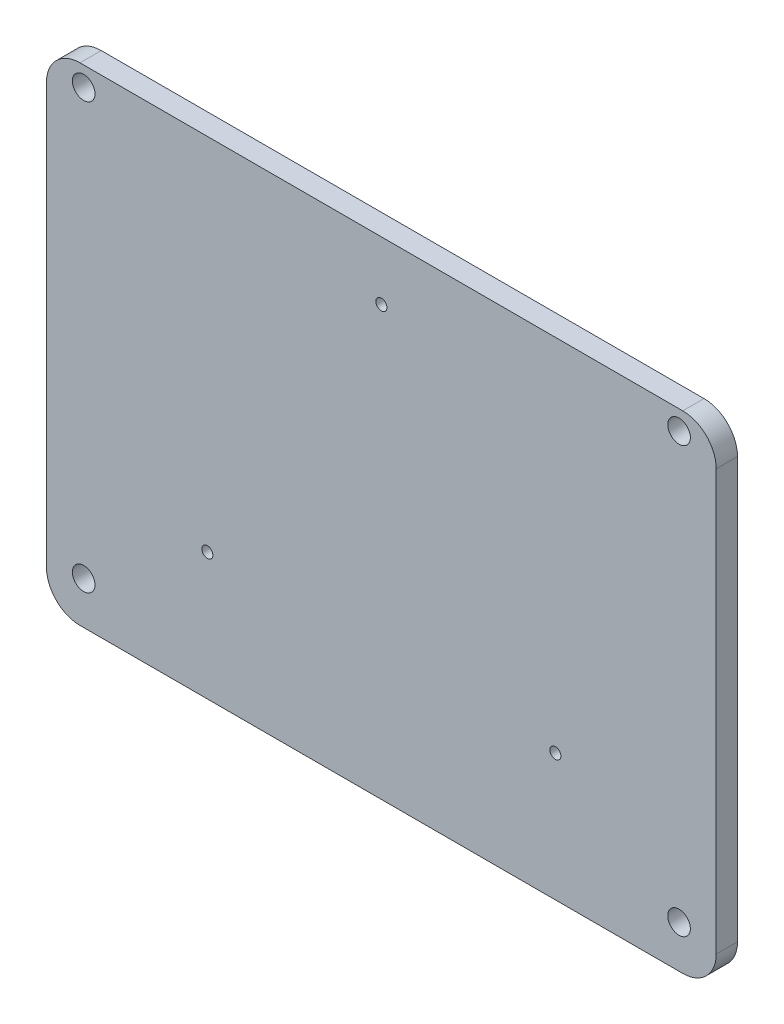
ISO-10303-21;
HEADER;
FILE_DESCRIPTION(('STEP AP214'),'2;1');
FILE_NAME('part.step','',(''),(''),'','','');
FILE_SCHEMA(('AUTOMOTIVE_DESIGN { 1 0 10303 214 1 1 1 1 }'));
ENDSEC;
DATA;
#1=APPLICATION_CONTEXT('core data for automotive mechanical design processes');
#2=APPLICATION_PROTOCOL_DEFINITION('international standard','automotive_design',2000,#1);
#3=PRODUCT_CONTEXT('',#1,'mechanical');
#4=PRODUCT('Part','Part','',(#3));
#5=PRODUCT_RELATED_PRODUCT_CATEGORY('part','',(#4));
#6=PRODUCT_DEFINITION_FORMATION('','',#4);
#7=PRODUCT_DEFINITION_CONTEXT('part definition',#1,'design');
#8=PRODUCT_DEFINITION('design','',#6,#7);
#9=PRODUCT_DEFINITION_SHAPE('','',#8);
#10=(LENGTH_UNIT() NAMED_UNIT(*) SI_UNIT(.MILLI.,.METRE.));
#11=(NAMED_UNIT(*) PLANE_ANGLE_UNIT() SI_UNIT($,.RADIAN.));
#12=(NAMED_UNIT(*) SI_UNIT($,.STERADIAN.) SOLID_ANGLE_UNIT());
#13=UNCERTAINTY_MEASURE_WITH_UNIT(LENGTH_MEASURE(1.E-05),#10,'distance_accuracy_value','');
#14=(GEOMETRIC_REPRESENTATION_CONTEXT(3) GLOBAL_UNCERTAINTY_ASSIGNED_CONTEXT((#13)) GLOBAL_UNIT_ASSIGNED_CONTEXT((#10,
#11,#12)) REPRESENTATION_CONTEXT('',''));
#15=CARTESIAN_POINT('',(0.,0.,0.));
#16=DIRECTION('',(0.,0.,1.));
#17=DIRECTION('',(1.,0.,0.));
#18=AXIS2_PLACEMENT_3D('',#15,#16,#17);
#19=CARTESIAN_POINT('',(0.,0.,6.35));
#20=DIRECTION('',(0.,0.,1.));
#21=DIRECTION('',(1.,0.,0.));
#22=AXIS2_PLACEMENT_3D('',#19,#20,#21);
#23=PLANE('',#22);
#24=DIRECTION('',(-1.,0.,0.));
#25=VECTOR('',#24,1.);
#26=CARTESIAN_POINT('',(0.,-68.,6.35));
#27=LINE('',#26,#25);
#28=CARTESIAN_POINT('',(90.,-68.,6.35));
#29=VERTEX_POINT('',#28);
#30=CARTESIAN_POINT('',(-90.,-68.,6.35));
#31=VERTEX_POINT('',#30);
#32=EDGE_CURVE('E127',#29,#31,#27,.T.);
#33=ORIENTED_EDGE('',*,*,#32,.F.);
#34=CARTESIAN_POINT('',(90.,-58.,6.35));
#35=DIRECTION('',(0.,0.,1.));
#36=DIRECTION('',(1.,0.,0.));
#37=AXIS2_PLACEMENT_3D('',#34,#35,#36);
#38=CIRCLE('',#37,10.);
#39=CARTESIAN_POINT('',(100.,-58.,6.35));
#40=VERTEX_POINT('',#39);
#41=EDGE_CURVE('E110',#29,#40,#38,.T.);
#42=ORIENTED_EDGE('',*,*,#41,.T.);
#43=DIRECTION('',(0.,1.,0.));
#44=VECTOR('',#43,1.);
#45=CARTESIAN_POINT('',(100.,77.5,6.35));
#46=LINE('',#45,#44);
#47=CARTESIAN_POINT('',(100.,67.5,6.35));
#48=VERTEX_POINT('',#47);
#49=EDGE_CURVE('E182',#40,#48,#46,.T.);
#50=ORIENTED_EDGE('',*,*,#49,.T.);
#51=CARTESIAN_POINT('',(90.,67.5,6.35));
#52=DIRECTION('',(0.,0.,1.));
#53=DIRECTION('',(1.,0.,0.));
#54=AXIS2_PLACEMENT_3D('',#51,#52,#53);
#55=CIRCLE('',#54,10.);
#56=CARTESIAN_POINT('',(90.,77.5,6.35));
#57=VERTEX_POINT('',#56);
#58=EDGE_CURVE('E121',#48,#57,#55,.T.);
#59=ORIENTED_EDGE('',*,*,#58,.T.);
#60=DIRECTION('',(-1.,0.,0.));
#61=VECTOR('',#60,1.);
#62=CARTESIAN_POINT('',(-100.,77.5,6.35));
#63=LINE('',#62,#61);
#64=CARTESIAN_POINT('',(-90.,77.5,6.35));
#65=VERTEX_POINT('',#64);
#66=EDGE_CURVE('E184',#57,#65,#63,.T.);
#67=ORIENTED_EDGE('',*,*,#66,.T.);
#68=CARTESIAN_POINT('',(-90.,67.5,6.35));
#69=DIRECTION('',(0.,0.,1.));
#70=DIRECTION('',(1.,0.,0.));
#71=AXIS2_PLACEMENT_3D('',#68,#69,#70);
#72=CIRCLE('',#71,10.);
#73=CARTESIAN_POINT('',(-100.,67.5,6.35));
#74=VERTEX_POINT('',#73);
#75=EDGE_CURVE('E198',#65,#74,#72,.T.);
#76=ORIENTED_EDGE('',*,*,#75,.T.);
#77=DIRECTION('',(0.,-1.,0.));
#78=VECTOR('',#77,1.);
#79=CARTESIAN_POINT('',(-100.,77.5,6.35));
#80=LINE('',#79,#78);
#81=CARTESIAN_POINT('',(-100.,-58.,6.35));
#82=VERTEX_POINT('',#81);
#83=EDGE_CURVE('E188',#74,#82,#80,.T.);
#84=ORIENTED_EDGE('',*,*,#83,.T.);
#85=CARTESIAN_POINT('',(-90.,-58.,6.35));
#86=DIRECTION('',(0.,0.,1.));
#87=DIRECTION('',(1.,0.,0.));
#88=AXIS2_PLACEMENT_3D('',#85,#86,#87);
#89=CIRCLE('',#88,10.);
#90=EDGE_CURVE('E131',#82,#31,#89,.T.);
#91=ORIENTED_EDGE('',*,*,#90,.T.);
#92=EDGE_LOOP('',(#33,#42,#50,#59,#67,#76,#84,#91));
#93=FACE_BOUND('',#92,.T.);
#94=CARTESIAN_POINT('',(51.9615242270663,-30.0000000000001,6.35));
#95=DIRECTION('',(0.,0.,-1.));
#96=DIRECTION('',(-1.,0.,0.));
#97=AXIS2_PLACEMENT_3D('',#94,#95,#96);
#98=CIRCLE('',#97,1.65);
#99=CARTESIAN_POINT('',(50.3115242270663,-30.0000000000001,6.35));
#100=VERTEX_POINT('',#99);
#101=EDGE_CURVE('E139',#100,#100,#98,.T.);
#102=ORIENTED_EDGE('',*,*,#101,.T.);
#103=EDGE_LOOP('',(#102));
#104=FACE_BOUND('',#103,.T.);
#105=CARTESIAN_POINT('',(-51.9615242270662,-30.0000000000003,6.35));
#106=DIRECTION('',(0.,0.,-1.));
#107=DIRECTION('',(-1.,0.,0.));
#108=AXIS2_PLACEMENT_3D('',#105,#106,#107);
#109=CIRCLE('',#108,1.65);
#110=CARTESIAN_POINT('',(-53.6115242270662,-30.0000000000003,6.35));
#111=VERTEX_POINT('',#110);
#112=EDGE_CURVE('E148',#111,#111,#109,.T.);
#113=ORIENTED_EDGE('',*,*,#112,.T.);
#114=EDGE_LOOP('',(#113));
#115=FACE_BOUND('',#114,.T.);
#116=CARTESIAN_POINT('',(0.,60.,6.35));
#117=DIRECTION('',(0.,0.,-1.));
#118=DIRECTION('',(-1.,0.,0.));
#119=AXIS2_PLACEMENT_3D('',#116,#117,#118);
#120=CIRCLE('',#119,1.65);
#121=CARTESIAN_POINT('',(-1.65,60.,6.35));
#122=VERTEX_POINT('',#121);
#123=EDGE_CURVE('E154',#122,#122,#120,.T.);
#124=ORIENTED_EDGE('',*,*,#123,.T.);
#125=EDGE_LOOP('',(#124));
#126=FACE_BOUND('',#125,.T.);
#127=CARTESIAN_POINT('',(88.9,-55.3,6.35));
#128=DIRECTION('',(0.,0.,1.));
#129=DIRECTION('',(1.,0.,0.));
#130=AXIS2_PLACEMENT_3D('',#127,#128,#129);
#131=CIRCLE('',#130,3.37999999999999);
#132=CARTESIAN_POINT('',(92.28,-55.3,6.35));
#133=VERTEX_POINT('',#132);
#134=EDGE_CURVE('E164',#133,#133,#131,.T.);
#135=ORIENTED_EDGE('',*,*,#134,.F.);
#136=EDGE_LOOP('',(#135));
#137=FACE_BOUND('',#136,.T.);
#138=CARTESIAN_POINT('',(-88.9,71.7,6.35));
#139=DIRECTION('',(0.,0.,1.));
#140=DIRECTION('',(1.,0.,0.));
#141=AXIS2_PLACEMENT_3D('',#138,#139,#140);
#142=CIRCLE('',#141,3.37999999999999);
#143=CARTESIAN_POINT('',(-85.52,71.7,6.35));
#144=VERTEX_POINT('',#143);
#145=EDGE_CURVE('E176',#144,#144,#142,.T.);
#146=ORIENTED_EDGE('',*,*,#145,.F.);
#147=EDGE_LOOP('',(#146));
#148=FACE_BOUND('',#147,.T.);
#149=CARTESIAN_POINT('',(88.9,71.7,6.35));
#150=DIRECTION('',(0.,0.,1.));
#151=DIRECTION('',(1.,0.,0.));
#152=AXIS2_PLACEMENT_3D('',#149,#150,#151);
#153=CIRCLE('',#152,3.37999999999999);
#154=CARTESIAN_POINT('',(92.28,71.7,6.35));
#155=VERTEX_POINT('',#154);
#156=EDGE_CURVE('E170',#155,#155,#153,.T.);
#157=ORIENTED_EDGE('',*,*,#156,.F.);
#158=EDGE_LOOP('',(#157));
#159=FACE_BOUND('',#158,.T.);
#160=CARTESIAN_POINT('',(-88.9,-55.3,6.35));
#161=DIRECTION('',(0.,0.,1.));
#162=DIRECTION('',(1.,0.,0.));
#163=AXIS2_PLACEMENT_3D('',#160,#161,#162);
#164=CIRCLE('',#163,3.37999999999999);
#165=CARTESIAN_POINT('',(-85.52,-55.3,6.35));
#166=VERTEX_POINT('',#165);
#167=EDGE_CURVE('E158',#166,#166,#164,.T.);
#168=ORIENTED_EDGE('',*,*,#167,.F.);
#169=EDGE_LOOP('',(#168));
#170=FACE_BOUND('',#169,.T.);
#171=ADVANCED_FACE('F43',(#93,#104,#115,#126,#137,#148,#159,#170),#23,.T.);
#172=CARTESIAN_POINT('',(0.,0.,0.));
#173=DIRECTION('',(0.,0.,1.));
#174=DIRECTION('',(1.,0.,0.));
#175=AXIS2_PLACEMENT_3D('',#172,#173,#174);
#176=PLANE('',#175);
#177=CARTESIAN_POINT('',(51.9615242270663,-30.0000000000001,0.));
#178=DIRECTION('',(0.,0.,-1.));
#179=DIRECTION('',(-1.,0.,0.));
#180=AXIS2_PLACEMENT_3D('',#177,#178,#179);
#181=CIRCLE('',#180,1.65);
#182=CARTESIAN_POINT('',(50.3115242270663,-30.0000000000001,0.));
#183=VERTEX_POINT('',#182);
#184=EDGE_CURVE('E136',#183,#183,#181,.T.);
#185=ORIENTED_EDGE('',*,*,#184,.F.);
#186=EDGE_LOOP('',(#185));
#187=FACE_BOUND('',#186,.T.);
#188=CARTESIAN_POINT('',(-51.9615242270662,-30.0000000000003,0.));
#189=DIRECTION('',(0.,0.,-1.));
#190=DIRECTION('',(-1.,0.,0.));
#191=AXIS2_PLACEMENT_3D('',#188,#189,#190);
#192=CIRCLE('',#191,1.65);
#193=CARTESIAN_POINT('',(-53.6115242270662,-30.0000000000003,0.));
#194=VERTEX_POINT('',#193);
#195=EDGE_CURVE('E145',#194,#194,#192,.T.);
#196=ORIENTED_EDGE('',*,*,#195,.F.);
#197=EDGE_LOOP('',(#196));
#198=FACE_BOUND('',#197,.T.);
#199=CARTESIAN_POINT('',(0.,60.,0.));
#200=DIRECTION('',(0.,0.,-1.));
#201=DIRECTION('',(-1.,0.,0.));
#202=AXIS2_PLACEMENT_3D('',#199,#200,#201);
#203=CIRCLE('',#202,1.65);
#204=CARTESIAN_POINT('',(-1.65,60.,0.));
#205=VERTEX_POINT('',#204);
#206=EDGE_CURVE('E151',#205,#205,#203,.T.);
#207=ORIENTED_EDGE('',*,*,#206,.F.);
#208=EDGE_LOOP('',(#207));
#209=FACE_BOUND('',#208,.T.);
#210=DIRECTION('',(0.,1.,0.));
#211=VECTOR('',#210,1.);
#212=CARTESIAN_POINT('',(100.,77.5,0.));
#213=LINE('',#212,#211);
#214=CARTESIAN_POINT('',(100.,-58.,0.));
#215=VERTEX_POINT('',#214);
#216=CARTESIAN_POINT('',(100.,67.5,0.));
#217=VERTEX_POINT('',#216);
#218=EDGE_CURVE('E179',#215,#217,#213,.T.);
#219=ORIENTED_EDGE('',*,*,#218,.F.);
#220=CARTESIAN_POINT('',(90.,-58.,0.));
#221=DIRECTION('',(0.,0.,1.));
#222=DIRECTION('',(1.,0.,0.));
#223=AXIS2_PLACEMENT_3D('',#220,#221,#222);
#224=CIRCLE('',#223,10.);
#225=CARTESIAN_POINT('',(90.,-68.,0.));
#226=VERTEX_POINT('',#225);
#227=EDGE_CURVE('E207',#215,#226,#224,.F.);
#228=ORIENTED_EDGE('',*,*,#227,.T.);
#229=DIRECTION('',(-1.,0.,0.));
#230=VECTOR('',#229,1.);
#231=CARTESIAN_POINT('',(-100.,-68.,0.));
#232=LINE('',#231,#230);
#233=CARTESIAN_POINT('',(-90.,-68.,0.));
#234=VERTEX_POINT('',#233);
#235=EDGE_CURVE('E130',#226,#234,#232,.T.);
#236=ORIENTED_EDGE('',*,*,#235,.T.);
#237=CARTESIAN_POINT('',(-90.,-58.,0.));
#238=DIRECTION('',(0.,0.,1.));
#239=DIRECTION('',(1.,0.,0.));
#240=AXIS2_PLACEMENT_3D('',#237,#238,#239);
#241=CIRCLE('',#240,10.);
#242=CARTESIAN_POINT('',(-100.,-58.,0.));
#243=VERTEX_POINT('',#242);
#244=EDGE_CURVE('E203',#234,#243,#241,.F.);
#245=ORIENTED_EDGE('',*,*,#244,.T.);
#246=DIRECTION('',(0.,-1.,0.));
#247=VECTOR('',#246,1.);
#248=CARTESIAN_POINT('',(-100.,77.5,0.));
#249=LINE('',#248,#247);
#250=CARTESIAN_POINT('',(-100.,67.5,0.));
#251=VERTEX_POINT('',#250);
#252=EDGE_CURVE('E185',#251,#243,#249,.T.);
#253=ORIENTED_EDGE('',*,*,#252,.F.);
#254=CARTESIAN_POINT('',(-90.,67.5,0.));
#255=DIRECTION('',(0.,0.,1.));
#256=DIRECTION('',(1.,0.,0.));
#257=AXIS2_PLACEMENT_3D('',#254,#255,#256);
#258=CIRCLE('',#257,10.);
#259=CARTESIAN_POINT('',(-90.,77.5,0.));
#260=VERTEX_POINT('',#259);
#261=EDGE_CURVE('E58',#251,#260,#258,.F.);
#262=ORIENTED_EDGE('',*,*,#261,.T.);
#263=DIRECTION('',(-1.,0.,0.));
#264=VECTOR('',#263,1.);
#265=CARTESIAN_POINT('',(-100.,77.5,0.));
#266=LINE('',#265,#264);
#267=CARTESIAN_POINT('',(90.,77.5,0.));
#268=VERTEX_POINT('',#267);
#269=EDGE_CURVE('E192',#268,#260,#266,.T.);
#270=ORIENTED_EDGE('',*,*,#269,.F.);
#271=CARTESIAN_POINT('',(90.,67.5,0.));
#272=DIRECTION('',(0.,0.,1.));
#273=DIRECTION('',(1.,0.,0.));
#274=AXIS2_PLACEMENT_3D('',#271,#272,#273);
#275=CIRCLE('',#274,10.);
#276=EDGE_CURVE('E66',#268,#217,#275,.F.);
#277=ORIENTED_EDGE('',*,*,#276,.T.);
#278=EDGE_LOOP('',(#219,#228,#236,#245,#253,#262,#270,#277));
#279=FACE_BOUND('',#278,.T.);
#280=CARTESIAN_POINT('',(-88.9,71.7,0.));
#281=DIRECTION('',(0.,0.,1.));
#282=DIRECTION('',(1.,0.,0.));
#283=AXIS2_PLACEMENT_3D('',#280,#281,#282);
#284=CIRCLE('',#283,3.37999999999999);
#285=CARTESIAN_POINT('',(-85.52,71.7,0.));
#286=VERTEX_POINT('',#285);
#287=EDGE_CURVE('E173',#286,#286,#284,.T.);
#288=ORIENTED_EDGE('',*,*,#287,.T.);
#289=EDGE_LOOP('',(#288));
#290=FACE_BOUND('',#289,.T.);
#291=CARTESIAN_POINT('',(88.9,71.7,0.));
#292=DIRECTION('',(0.,0.,1.));
#293=DIRECTION('',(1.,0.,0.));
#294=AXIS2_PLACEMENT_3D('',#291,#292,#293);
#295=CIRCLE('',#294,3.37999999999999);
#296=CARTESIAN_POINT('',(92.28,71.7,0.));
#297=VERTEX_POINT('',#296);
#298=EDGE_CURVE('E167',#297,#297,#295,.T.);
#299=ORIENTED_EDGE('',*,*,#298,.T.);
#300=EDGE_LOOP('',(#299));
#301=FACE_BOUND('',#300,.T.);
#302=CARTESIAN_POINT('',(88.9,-55.3,0.));
#303=DIRECTION('',(0.,0.,1.));
#304=DIRECTION('',(1.,0.,0.));
#305=AXIS2_PLACEMENT_3D('',#302,#303,#304);
#306=CIRCLE('',#305,3.37999999999999);
#307=CARTESIAN_POINT('',(92.28,-55.3,0.));
#308=VERTEX_POINT('',#307);
#309=EDGE_CURVE('E161',#308,#308,#306,.T.);
#310=ORIENTED_EDGE('',*,*,#309,.T.);
#311=EDGE_LOOP('',(#310));
#312=FACE_BOUND('',#311,.T.);
#313=CARTESIAN_POINT('',(-88.9,-55.3,0.));
#314=DIRECTION('',(0.,0.,1.));
#315=DIRECTION('',(1.,0.,0.));
#316=AXIS2_PLACEMENT_3D('',#313,#314,#315);
#317=CIRCLE('',#316,3.37999999999999);
#318=CARTESIAN_POINT('',(-85.52,-55.3,0.));
#319=VERTEX_POINT('',#318);
#320=EDGE_CURVE('E157',#319,#319,#317,.T.);
#321=ORIENTED_EDGE('',*,*,#320,.T.);
#322=EDGE_LOOP('',(#321));
#323=FACE_BOUND('',#322,.T.);
#324=ADVANCED_FACE('F226',(#187,#198,#209,#279,#290,#301,#312,#323),#176,.F.);
#325=CARTESIAN_POINT('',(100.,77.5,6.35));
#326=DIRECTION('',(-1.,0.,0.));
#327=DIRECTION('',(0.,0.,1.));
#328=AXIS2_PLACEMENT_3D('',#325,#326,#327);
#329=PLANE('',#328);
#330=ORIENTED_EDGE('',*,*,#49,.F.);
#331=DIRECTION('',(0.,0.,1.));
#332=VECTOR('',#331,1.);
#333=CARTESIAN_POINT('',(100.,-58.,6.35));
#334=LINE('',#333,#332);
#335=EDGE_CURVE('E115',#40,#215,#334,.F.);
#336=ORIENTED_EDGE('',*,*,#335,.T.);
#337=ORIENTED_EDGE('',*,*,#218,.T.);
#338=DIRECTION('',(0.,0.,-1.));
#339=VECTOR('',#338,1.);
#340=CARTESIAN_POINT('',(100.,67.5,6.35));
#341=LINE('',#340,#339);
#342=EDGE_CURVE('E120',#217,#48,#341,.F.);
#343=ORIENTED_EDGE('',*,*,#342,.T.);
#344=EDGE_LOOP('',(#330,#336,#337,#343));
#345=FACE_BOUND('',#344,.T.);
#346=ADVANCED_FACE('F238',(#345),#329,.F.);
#347=CARTESIAN_POINT('',(-100.,77.5,6.35));
#348=DIRECTION('',(0.,-1.,0.));
#349=DIRECTION('',(0.,0.,-1.));
#350=AXIS2_PLACEMENT_3D('',#347,#348,#349);
#351=PLANE('',#350);
#352=ORIENTED_EDGE('',*,*,#66,.F.);
#353=DIRECTION('',(0.,0.,-1.));
#354=VECTOR('',#353,1.);
#355=CARTESIAN_POINT('',(90.,77.5,6.35));
#356=LINE('',#355,#354);
#357=EDGE_CURVE('E211',#57,#268,#356,.T.);
#358=ORIENTED_EDGE('',*,*,#357,.T.);
#359=ORIENTED_EDGE('',*,*,#269,.T.);
#360=DIRECTION('',(0.,0.,-1.));
#361=VECTOR('',#360,1.);
#362=CARTESIAN_POINT('',(-90.,77.5,6.35));
#363=LINE('',#362,#361);
#364=EDGE_CURVE('E209',#260,#65,#363,.F.);
#365=ORIENTED_EDGE('',*,*,#364,.T.);
#366=EDGE_LOOP('',(#352,#358,#359,#365));
#367=FACE_BOUND('',#366,.T.);
#368=ADVANCED_FACE('F247',(#367),#351,.F.);
#369=CARTESIAN_POINT('',(-100.,77.5,6.35));
#370=DIRECTION('',(1.,0.,0.));
#371=DIRECTION('',(0.,0.,-1.));
#372=AXIS2_PLACEMENT_3D('',#369,#370,#371);
#373=PLANE('',#372);
#374=ORIENTED_EDGE('',*,*,#83,.F.);
#375=DIRECTION('',(0.,0.,-1.));
#376=VECTOR('',#375,1.);
#377=CARTESIAN_POINT('',(-100.,67.5,6.35));
#378=LINE('',#377,#376);
#379=EDGE_CURVE('E11',#74,#251,#378,.T.);
#380=ORIENTED_EDGE('',*,*,#379,.T.);
#381=ORIENTED_EDGE('',*,*,#252,.T.);
#382=DIRECTION('',(0.,0.,1.));
#383=VECTOR('',#382,1.);
#384=CARTESIAN_POINT('',(-100.,-58.,6.35));
#385=LINE('',#384,#383);
#386=EDGE_CURVE('E51',#243,#82,#385,.T.);
#387=ORIENTED_EDGE('',*,*,#386,.T.);
#388=EDGE_LOOP('',(#374,#380,#381,#387));
#389=FACE_BOUND('',#388,.T.);
#390=ADVANCED_FACE('F216',(#389),#373,.F.);
#391=CARTESIAN_POINT('',(-88.9,71.7,6.35));
#392=DIRECTION('',(0.,0.,-1.));
#393=DIRECTION('',(-1.,0.,0.));
#394=AXIS2_PLACEMENT_3D('',#391,#392,#393);
#395=CYLINDRICAL_SURFACE('',#394,3.37999999999999);
#396=ORIENTED_EDGE('',*,*,#145,.T.);
#397=EDGE_LOOP('',(#396));
#398=FACE_BOUND('',#397,.T.);
#399=ORIENTED_EDGE('',*,*,#287,.F.);
#400=EDGE_LOOP('',(#399));
#401=FACE_BOUND('',#400,.T.);
#402=ADVANCED_FACE('F242',(#398,#401),#395,.F.);
#403=CARTESIAN_POINT('',(88.9,71.7,6.35));
#404=DIRECTION('',(0.,0.,-1.));
#405=DIRECTION('',(-1.,0.,0.));
#406=AXIS2_PLACEMENT_3D('',#403,#404,#405);
#407=CYLINDRICAL_SURFACE('',#406,3.37999999999999);
#408=ORIENTED_EDGE('',*,*,#156,.T.);
#409=EDGE_LOOP('',(#408));
#410=FACE_BOUND('',#409,.T.);
#411=ORIENTED_EDGE('',*,*,#298,.F.);
#412=EDGE_LOOP('',(#411));
#413=FACE_BOUND('',#412,.T.);
#414=ADVANCED_FACE('F363',(#410,#413),#407,.F.);
#415=CARTESIAN_POINT('',(88.9,-55.3,6.35));
#416=DIRECTION('',(0.,0.,-1.));
#417=DIRECTION('',(-1.,0.,0.));
#418=AXIS2_PLACEMENT_3D('',#415,#416,#417);
#419=CYLINDRICAL_SURFACE('',#418,3.37999999999999);
#420=ORIENTED_EDGE('',*,*,#134,.T.);
#421=EDGE_LOOP('',(#420));
#422=FACE_BOUND('',#421,.T.);
#423=ORIENTED_EDGE('',*,*,#309,.F.);
#424=EDGE_LOOP('',(#423));
#425=FACE_BOUND('',#424,.T.);
#426=ADVANCED_FACE('F351',(#422,#425),#419,.F.);
#427=CARTESIAN_POINT('',(-88.9,-55.3,6.35));
#428=DIRECTION('',(0.,0.,-1.));
#429=DIRECTION('',(-1.,0.,0.));
#430=AXIS2_PLACEMENT_3D('',#427,#428,#429);
#431=CYLINDRICAL_SURFACE('',#430,3.37999999999999);
#432=ORIENTED_EDGE('',*,*,#167,.T.);
#433=EDGE_LOOP('',(#432));
#434=FACE_BOUND('',#433,.T.);
#435=ORIENTED_EDGE('',*,*,#320,.F.);
#436=EDGE_LOOP('',(#435));
#437=FACE_BOUND('',#436,.T.);
#438=ADVANCED_FACE('F339',(#434,#437),#431,.F.);
#439=CARTESIAN_POINT('',(0.,60.,0.));
#440=DIRECTION('',(0.,0.,-1.));
#441=DIRECTION('',(-1.,0.,0.));
#442=AXIS2_PLACEMENT_3D('',#439,#440,#441);
#443=CYLINDRICAL_SURFACE('',#442,1.65);
#444=ORIENTED_EDGE('',*,*,#123,.F.);
#445=EDGE_LOOP('',(#444));
#446=FACE_BOUND('',#445,.T.);
#447=ORIENTED_EDGE('',*,*,#206,.T.);
#448=EDGE_LOOP('',(#447));
#449=FACE_BOUND('',#448,.T.);
#450=ADVANCED_FACE('F327',(#446,#449),#443,.F.);
#451=CARTESIAN_POINT('',(-51.9615242270662,-30.0000000000003,0.));
#452=DIRECTION('',(0.,0.,-1.));
#453=DIRECTION('',(-1.,0.,0.));
#454=AXIS2_PLACEMENT_3D('',#451,#452,#453);
#455=CYLINDRICAL_SURFACE('',#454,1.65);
#456=ORIENTED_EDGE('',*,*,#112,.F.);
#457=EDGE_LOOP('',(#456));
#458=FACE_BOUND('',#457,.T.);
#459=ORIENTED_EDGE('',*,*,#195,.T.);
#460=EDGE_LOOP('',(#459));
#461=FACE_BOUND('',#460,.T.);
#462=ADVANCED_FACE('F314',(#458,#461),#455,.F.);
#463=CARTESIAN_POINT('',(51.9615242270663,-30.0000000000001,0.));
#464=DIRECTION('',(0.,0.,-1.));
#465=DIRECTION('',(-1.,0.,0.));
#466=AXIS2_PLACEMENT_3D('',#463,#464,#465);
#467=CYLINDRICAL_SURFACE('',#466,1.65);
#468=ORIENTED_EDGE('',*,*,#101,.F.);
#469=EDGE_LOOP('',(#468));
#470=FACE_BOUND('',#469,.T.);
#471=ORIENTED_EDGE('',*,*,#184,.T.);
#472=EDGE_LOOP('',(#471));
#473=FACE_BOUND('',#472,.T.);
#474=ADVANCED_FACE('F302',(#470,#473),#467,.F.);
#475=CARTESIAN_POINT('',(-100.,-68.,0.));
#476=DIRECTION('',(0.,1.,0.));
#477=DIRECTION('',(0.,0.,1.));
#478=AXIS2_PLACEMENT_3D('',#475,#476,#477);
#479=PLANE('',#478);
#480=ORIENTED_EDGE('',*,*,#235,.F.);
#481=DIRECTION('',(0.,0.,1.));
#482=VECTOR('',#481,1.);
#483=CARTESIAN_POINT('',(90.,-68.,0.));
#484=LINE('',#483,#482);
#485=EDGE_CURVE('E114',#226,#29,#484,.T.);
#486=ORIENTED_EDGE('',*,*,#485,.T.);
#487=ORIENTED_EDGE('',*,*,#32,.T.);
#488=DIRECTION('',(0.,0.,1.));
#489=VECTOR('',#488,1.);
#490=CARTESIAN_POINT('',(-90.,-68.,0.));
#491=LINE('',#490,#489);
#492=EDGE_CURVE('E132',#31,#234,#491,.F.);
#493=ORIENTED_EDGE('',*,*,#492,.T.);
#494=EDGE_LOOP('',(#480,#486,#487,#493));
#495=FACE_BOUND('',#494,.T.);
#496=ADVANCED_FACE('F126',(#495),#479,.F.);
#497=CARTESIAN_POINT('',(90.,-58.,0.));
#498=DIRECTION('',(0.,0.,1.));
#499=DIRECTION('',(1.,0.,0.));
#500=AXIS2_PLACEMENT_3D('',#497,#498,#499);
#501=CYLINDRICAL_SURFACE('',#500,10.);
#502=ORIENTED_EDGE('',*,*,#227,.F.);
#503=ORIENTED_EDGE('',*,*,#335,.F.);
#504=ORIENTED_EDGE('',*,*,#41,.F.);
#505=ORIENTED_EDGE('',*,*,#485,.F.);
#506=EDGE_LOOP('',(#502,#503,#504,#505));
#507=FACE_BOUND('',#506,.T.);
#508=ADVANCED_FACE('F113',(#507),#501,.T.);
#509=CARTESIAN_POINT('',(90.,67.5,6.35));
#510=DIRECTION('',(0.,0.,-1.));
#511=DIRECTION('',(-1.,0.,0.));
#512=AXIS2_PLACEMENT_3D('',#509,#510,#511);
#513=CYLINDRICAL_SURFACE('',#512,10.);
#514=ORIENTED_EDGE('',*,*,#58,.F.);
#515=ORIENTED_EDGE('',*,*,#342,.F.);
#516=ORIENTED_EDGE('',*,*,#276,.F.);
#517=ORIENTED_EDGE('',*,*,#357,.F.);
#518=EDGE_LOOP('',(#514,#515,#516,#517));
#519=FACE_BOUND('',#518,.T.);
#520=ADVANCED_FACE('F232',(#519),#513,.T.);
#521=CARTESIAN_POINT('',(-90.,67.5,6.35));
#522=DIRECTION('',(0.,0.,-1.));
#523=DIRECTION('',(-1.,0.,0.));
#524=AXIS2_PLACEMENT_3D('',#521,#522,#523);
#525=CYLINDRICAL_SURFACE('',#524,10.);
#526=ORIENTED_EDGE('',*,*,#75,.F.);
#527=ORIENTED_EDGE('',*,*,#364,.F.);
#528=ORIENTED_EDGE('',*,*,#261,.F.);
#529=ORIENTED_EDGE('',*,*,#379,.F.);
#530=EDGE_LOOP('',(#526,#527,#528,#529));
#531=FACE_BOUND('',#530,.T.);
#532=ADVANCED_FACE('F224',(#531),#525,.T.);
#533=CARTESIAN_POINT('',(-90.,-58.,6.35));
#534=DIRECTION('',(0.,0.,1.));
#535=DIRECTION('',(1.,0.,0.));
#536=AXIS2_PLACEMENT_3D('',#533,#534,#535);
#537=CYLINDRICAL_SURFACE('',#536,10.);
#538=ORIENTED_EDGE('',*,*,#244,.F.);
#539=ORIENTED_EDGE('',*,*,#492,.F.);
#540=ORIENTED_EDGE('',*,*,#90,.F.);
#541=ORIENTED_EDGE('',*,*,#386,.F.);
#542=EDGE_LOOP('',(#538,#539,#540,#541));
#543=FACE_BOUND('',#542,.T.);
#544=ADVANCED_FACE('F45',(#543),#537,.T.);
#545=CLOSED_SHELL('',(#171,#324,#346,#368,#390,#402,#414,#426,#438,#450,#462,#474,#496,#508,
#520,#532,#544));
#546=MANIFOLD_SOLID_BREP('B2',#545);
#547=ADVANCED_BREP_SHAPE_REPRESENTATION('',(#18,#546),#14);
#548=SHAPE_DEFINITION_REPRESENTATION(#9,#547);
ENDSEC;
END-ISO-10303-21;
